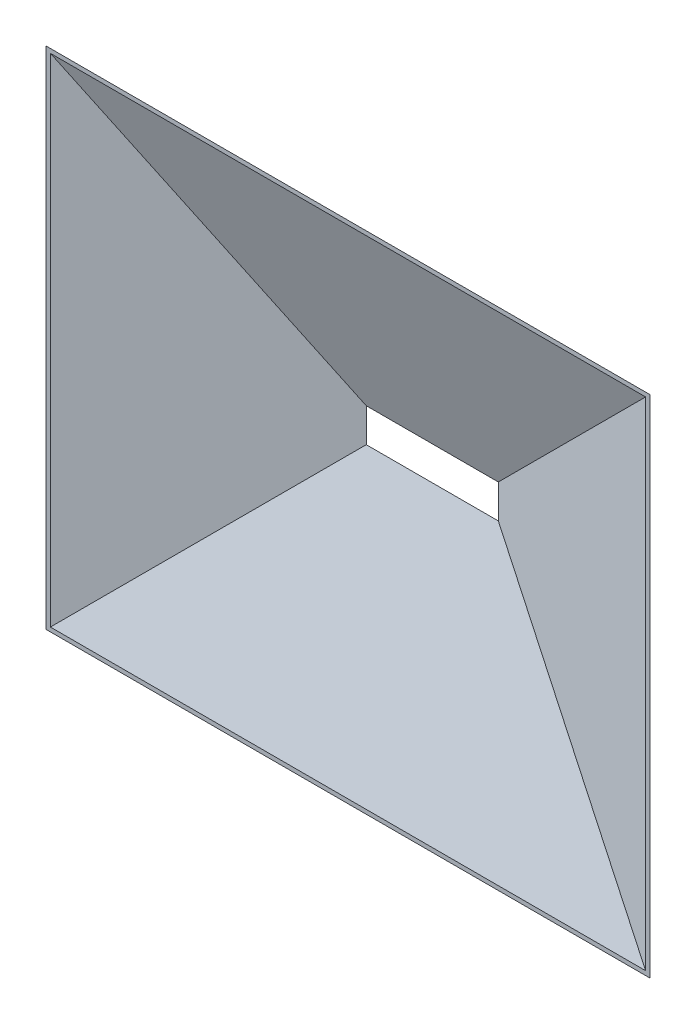
ISO-10303-21;
HEADER;
FILE_DESCRIPTION(('STEP AP214'),'2;1');
FILE_NAME('part.step','',(''),(''),'','','');
FILE_SCHEMA(('AUTOMOTIVE_DESIGN { 1 0 10303 214 1 1 1 1 }'));
ENDSEC;
DATA;
#1=APPLICATION_CONTEXT('core data for automotive mechanical design processes');
#2=APPLICATION_PROTOCOL_DEFINITION('international standard','automotive_design',2000,#1);
#3=PRODUCT_CONTEXT('',#1,'mechanical');
#4=PRODUCT('Part','Part','',(#3));
#5=PRODUCT_RELATED_PRODUCT_CATEGORY('part','',(#4));
#6=PRODUCT_DEFINITION_FORMATION('','',#4);
#7=PRODUCT_DEFINITION_CONTEXT('part definition',#1,'design');
#8=PRODUCT_DEFINITION('design','',#6,#7);
#9=PRODUCT_DEFINITION_SHAPE('','',#8);
#10=(LENGTH_UNIT() NAMED_UNIT(*) SI_UNIT(.MILLI.,.METRE.));
#11=(NAMED_UNIT(*) PLANE_ANGLE_UNIT() SI_UNIT($,.RADIAN.));
#12=(NAMED_UNIT(*) SI_UNIT($,.STERADIAN.) SOLID_ANGLE_UNIT());
#13=UNCERTAINTY_MEASURE_WITH_UNIT(LENGTH_MEASURE(1.E-05),#10,'distance_accuracy_value','');
#14=(GEOMETRIC_REPRESENTATION_CONTEXT(3) GLOBAL_UNCERTAINTY_ASSIGNED_CONTEXT((#13)) GLOBAL_UNIT_ASSIGNED_CONTEXT((#10,
#11,#12)) REPRESENTATION_CONTEXT('',''));
#15=CARTESIAN_POINT('',(0.,0.,0.));
#16=DIRECTION('',(0.,0.,1.));
#17=DIRECTION('',(1.,0.,0.));
#18=AXIS2_PLACEMENT_3D('',#15,#16,#17);
#19=CARTESIAN_POINT('',(50.,-15.,0.));
#20=DIRECTION('',(0.342020143325668,0.,-0.939692620785909));
#21=DIRECTION('',(-0.939692620785909,0.,-0.342020143325668));
#22=AXIS2_PLACEMENT_3D('',#19,#20,#21);
#23=PLANE('',#22);
#24=DIRECTION('',(0.,1.,0.));
#25=VECTOR('',#24,1.);
#26=CARTESIAN_POINT('',(50.,-15.,0.));
#27=LINE('',#26,#25);
#28=CARTESIAN_POINT('',(50.,-15.,0.));
#29=VERTEX_POINT('',#28);
#30=CARTESIAN_POINT('',(50.,15.,0.));
#31=VERTEX_POINT('',#30);
#32=EDGE_CURVE('E137',#29,#31,#27,.T.);
#33=ORIENTED_EDGE('',*,*,#32,.T.);
#34=DIRECTION('',(-0.684791078771736,-0.684791078771736,-0.249243569363953));
#35=VECTOR('',#34,1.);
#36=CARTESIAN_POINT('',(3.10611784346419,-31.8938821565358,-17.067977274166));
#37=LINE('',#36,#35);
#38=CARTESIAN_POINT('',(214.848645167278,179.848645167278,60.));
#39=VERTEX_POINT('',#38);
#40=EDGE_CURVE('E11',#39,#31,#37,.T.);
#41=ORIENTED_EDGE('',*,*,#40,.F.);
#42=DIRECTION('',(0.,-1.,0.));
#43=VECTOR('',#42,1.);
#44=CARTESIAN_POINT('',(214.848645167278,0.,60.));
#45=LINE('',#44,#43);
#46=CARTESIAN_POINT('',(214.848645167278,-179.848645167278,60.));
#47=VERTEX_POINT('',#46);
#48=EDGE_CURVE('E165',#47,#39,#45,.F.);
#49=ORIENTED_EDGE('',*,*,#48,.F.);
#50=DIRECTION('',(-0.684791078771736,0.684791078771736,-0.249243569363953));
#51=VECTOR('',#50,1.);
#52=CARTESIAN_POINT('',(50.,-15.,0.));
#53=LINE('',#52,#51);
#54=EDGE_CURVE('E167',#47,#29,#53,.T.);
#55=ORIENTED_EDGE('',*,*,#54,.T.);
#56=EDGE_LOOP('',(#33,#41,#49,#55));
#57=FACE_BOUND('',#56,.T.);
#58=ADVANCED_FACE('F38',(#57),#23,.T.);
#59=CARTESIAN_POINT('',(-50.,15.,0.));
#60=DIRECTION('',(0.,0.342020143325668,-0.939692620785909));
#61=DIRECTION('',(0.,0.939692620785909,0.342020143325668));
#62=AXIS2_PLACEMENT_3D('',#59,#60,#61);
#63=PLANE('',#62);
#64=DIRECTION('',(-1.,0.,0.));
#65=VECTOR('',#64,1.);
#66=CARTESIAN_POINT('',(-50.,15.,0.));
#67=LINE('',#66,#65);
#68=CARTESIAN_POINT('',(-50.,15.,0.));
#69=VERTEX_POINT('',#68);
#70=EDGE_CURVE('E157',#31,#69,#67,.T.);
#71=ORIENTED_EDGE('',*,*,#70,.T.);
#72=DIRECTION('',(0.684791078771736,-0.684791078771736,-0.249243569363953));
#73=VECTOR('',#72,1.);
#74=CARTESIAN_POINT('',(-35.9318353530393,0.931835353039258,-5.12039318224979));
#75=LINE('',#74,#73);
#76=CARTESIAN_POINT('',(-214.848645167278,179.848645167278,60.));
#77=VERTEX_POINT('',#76);
#78=EDGE_CURVE('E48',#77,#69,#75,.T.);
#79=ORIENTED_EDGE('',*,*,#78,.F.);
#80=DIRECTION('',(1.,0.,0.));
#81=VECTOR('',#80,1.);
#82=CARTESIAN_POINT('',(0.,179.848645167278,60.));
#83=LINE('',#82,#81);
#84=EDGE_CURVE('E181',#39,#77,#83,.F.);
#85=ORIENTED_EDGE('',*,*,#84,.F.);
#86=ORIENTED_EDGE('',*,*,#40,.T.);
#87=EDGE_LOOP('',(#71,#79,#85,#86));
#88=FACE_BOUND('',#87,.T.);
#89=ADVANCED_FACE('F40',(#88),#63,.T.);
#90=CARTESIAN_POINT('',(-50.,-15.,0.));
#91=DIRECTION('',(-0.342020143325668,0.,-0.939692620785909));
#92=DIRECTION('',(-0.939692620785909,0.,0.342020143325668));
#93=AXIS2_PLACEMENT_3D('',#90,#91,#92);
#94=PLANE('',#93);
#95=DIRECTION('',(0.,-1.,0.));
#96=VECTOR('',#95,1.);
#97=CARTESIAN_POINT('',(-50.,-15.,0.));
#98=LINE('',#97,#96);
#99=CARTESIAN_POINT('',(-50.,-15.,0.));
#100=VERTEX_POINT('',#99);
#101=EDGE_CURVE('E160',#69,#100,#98,.T.);
#102=ORIENTED_EDGE('',*,*,#101,.T.);
#103=DIRECTION('',(0.684791078771736,0.684791078771736,-0.249243569363953));
#104=VECTOR('',#103,1.);
#105=CARTESIAN_POINT('',(-50.,-15.,0.));
#106=LINE('',#105,#104);
#107=CARTESIAN_POINT('',(-214.848645167278,-179.848645167278,60.));
#108=VERTEX_POINT('',#107);
#109=EDGE_CURVE('E171',#108,#100,#106,.T.);
#110=ORIENTED_EDGE('',*,*,#109,.F.);
#111=DIRECTION('',(0.,1.,0.));
#112=VECTOR('',#111,1.);
#113=CARTESIAN_POINT('',(-214.848645167278,0.,60.));
#114=LINE('',#113,#112);
#115=EDGE_CURVE('E183',#77,#108,#114,.F.);
#116=ORIENTED_EDGE('',*,*,#115,.F.);
#117=ORIENTED_EDGE('',*,*,#78,.T.);
#118=EDGE_LOOP('',(#102,#110,#116,#117));
#119=FACE_BOUND('',#118,.T.);
#120=ADVANCED_FACE('F203',(#119),#94,.T.);
#121=CARTESIAN_POINT('',(-50.,-15.,0.));
#122=DIRECTION('',(0.,-0.342020143325668,-0.939692620785909));
#123=DIRECTION('',(0.,0.939692620785909,-0.342020143325668));
#124=AXIS2_PLACEMENT_3D('',#121,#122,#123);
#125=PLANE('',#124);
#126=DIRECTION('',(1.,0.,0.));
#127=VECTOR('',#126,1.);
#128=CARTESIAN_POINT('',(-50.,-15.,0.));
#129=LINE('',#128,#127);
#130=EDGE_CURVE('E163',#100,#29,#129,.T.);
#131=ORIENTED_EDGE('',*,*,#130,.T.);
#132=ORIENTED_EDGE('',*,*,#54,.F.);
#133=DIRECTION('',(-1.,0.,0.));
#134=VECTOR('',#133,1.);
#135=CARTESIAN_POINT('',(0.,-179.848645167278,60.));
#136=LINE('',#135,#134);
#137=EDGE_CURVE('E42',#108,#47,#136,.F.);
#138=ORIENTED_EDGE('',*,*,#137,.F.);
#139=ORIENTED_EDGE('',*,*,#109,.T.);
#140=EDGE_LOOP('',(#131,#132,#138,#139));
#141=FACE_BOUND('',#140,.T.);
#142=ADVANCED_FACE('F195',(#141),#125,.T.);
#143=CARTESIAN_POINT('',(0.,0.,60.));
#144=DIRECTION('',(0.,0.,-1.));
#145=DIRECTION('',(-1.,0.,0.));
#146=AXIS2_PLACEMENT_3D('',#143,#144,#145);
#147=PLANE('',#146);
#148=DIRECTION('',(-1.,0.,0.));
#149=VECTOR('',#148,1.);
#150=CARTESIAN_POINT('',(0.,-176.848645167279,60.));
#151=LINE('',#150,#149);
#152=CARTESIAN_POINT('',(211.848645167279,-176.848645167279,60.));
#153=VERTEX_POINT('',#152);
#154=CARTESIAN_POINT('',(-211.848645167279,-176.848645167279,60.));
#155=VERTEX_POINT('',#154);
#156=EDGE_CURVE('E139',#153,#155,#151,.T.);
#157=ORIENTED_EDGE('',*,*,#156,.T.);
#158=DIRECTION('',(0.,1.,0.));
#159=VECTOR('',#158,1.);
#160=CARTESIAN_POINT('',(-211.848645167279,0.,60.));
#161=LINE('',#160,#159);
#162=CARTESIAN_POINT('',(-211.848645167279,176.848645167279,60.));
#163=VERTEX_POINT('',#162);
#164=EDGE_CURVE('E130',#155,#163,#161,.T.);
#165=ORIENTED_EDGE('',*,*,#164,.T.);
#166=DIRECTION('',(1.,0.,0.));
#167=VECTOR('',#166,1.);
#168=CARTESIAN_POINT('',(0.,176.848645167279,60.));
#169=LINE('',#168,#167);
#170=CARTESIAN_POINT('',(211.848645167279,176.848645167279,60.));
#171=VERTEX_POINT('',#170);
#172=EDGE_CURVE('E146',#163,#171,#169,.T.);
#173=ORIENTED_EDGE('',*,*,#172,.T.);
#174=DIRECTION('',(0.,-1.,0.));
#175=VECTOR('',#174,1.);
#176=CARTESIAN_POINT('',(211.848645167279,0.,60.));
#177=LINE('',#176,#175);
#178=EDGE_CURVE('E56',#171,#153,#177,.T.);
#179=ORIENTED_EDGE('',*,*,#178,.T.);
#180=EDGE_LOOP('',(#157,#165,#173,#179));
#181=FACE_BOUND('',#180,.T.);
#182=ORIENTED_EDGE('',*,*,#48,.T.);
#183=ORIENTED_EDGE('',*,*,#84,.T.);
#184=ORIENTED_EDGE('',*,*,#115,.T.);
#185=ORIENTED_EDGE('',*,*,#137,.T.);
#186=EDGE_LOOP('',(#182,#183,#184,#185));
#187=FACE_BOUND('',#186,.T.);
#188=ADVANCED_FACE('F191',(#181,#187),#147,.F.);
#189=CARTESIAN_POINT('',(0.,0.,0.));
#190=DIRECTION('',(0.,0.,-1.));
#191=DIRECTION('',(-1.,0.,0.));
#192=AXIS2_PLACEMENT_3D('',#189,#190,#191);
#193=PLANE('',#192);
#194=DIRECTION('',(0.,1.,0.));
#195=VECTOR('',#194,1.);
#196=CARTESIAN_POINT('',(-47.,0.,0.));
#197=LINE('',#196,#195);
#198=CARTESIAN_POINT('',(-47.,-12.,0.));
#199=VERTEX_POINT('',#198);
#200=CARTESIAN_POINT('',(-47.,12.,0.));
#201=VERTEX_POINT('',#200);
#202=EDGE_CURVE('E64',#199,#201,#197,.T.);
#203=ORIENTED_EDGE('',*,*,#202,.F.);
#204=DIRECTION('',(-1.,0.,0.));
#205=VECTOR('',#204,1.);
#206=CARTESIAN_POINT('',(0.,-12.,0.));
#207=LINE('',#206,#205);
#208=CARTESIAN_POINT('',(47.,-12.,0.));
#209=VERTEX_POINT('',#208);
#210=EDGE_CURVE('E126',#209,#199,#207,.T.);
#211=ORIENTED_EDGE('',*,*,#210,.F.);
#212=DIRECTION('',(0.,-1.,0.));
#213=VECTOR('',#212,1.);
#214=CARTESIAN_POINT('',(47.,0.,0.));
#215=LINE('',#214,#213);
#216=CARTESIAN_POINT('',(47.,12.,0.));
#217=VERTEX_POINT('',#216);
#218=EDGE_CURVE('E108',#217,#209,#215,.T.);
#219=ORIENTED_EDGE('',*,*,#218,.F.);
#220=DIRECTION('',(1.,0.,0.));
#221=VECTOR('',#220,1.);
#222=CARTESIAN_POINT('',(0.,12.,0.));
#223=LINE('',#222,#221);
#224=EDGE_CURVE('E118',#201,#217,#223,.T.);
#225=ORIENTED_EDGE('',*,*,#224,.F.);
#226=EDGE_LOOP('',(#203,#211,#219,#225));
#227=FACE_BOUND('',#226,.T.);
#228=ORIENTED_EDGE('',*,*,#32,.F.);
#229=ORIENTED_EDGE('',*,*,#130,.F.);
#230=ORIENTED_EDGE('',*,*,#101,.F.);
#231=ORIENTED_EDGE('',*,*,#70,.F.);
#232=EDGE_LOOP('',(#228,#229,#230,#231));
#233=FACE_BOUND('',#232,.T.);
#234=ADVANCED_FACE('F123',(#227,#233),#193,.T.);
#235=CARTESIAN_POINT('',(-47.,0.,0.));
#236=DIRECTION('',(-0.342020143325666,0.,-0.939692620785909));
#237=DIRECTION('',(-0.939692620785909,0.,0.342020143325666));
#238=AXIS2_PLACEMENT_3D('',#235,#236,#237);
#239=PLANE('',#238);
#240=ORIENTED_EDGE('',*,*,#202,.T.);
#241=DIRECTION('',(0.684791078771736,-0.684791078771736,-0.249243569363952));
#242=VECTOR('',#241,1.);
#243=CARTESIAN_POINT('',(-41.3727341412157,6.3727341412157,-2.04815727289991));
#244=LINE('',#243,#242);
#245=EDGE_CURVE('E115',#163,#201,#244,.T.);
#246=ORIENTED_EDGE('',*,*,#245,.F.);
#247=ORIENTED_EDGE('',*,*,#164,.F.);
#248=DIRECTION('',(0.684791078771736,0.684791078771736,-0.249243569363952));
#249=VECTOR('',#248,1.);
#250=CARTESIAN_POINT('',(-24.9598753864282,10.0401246135718,-8.02194931885797));
#251=LINE('',#250,#249);
#252=EDGE_CURVE('E134',#155,#199,#251,.T.);
#253=ORIENTED_EDGE('',*,*,#252,.T.);
#254=EDGE_LOOP('',(#240,#246,#247,#253));
#255=FACE_BOUND('',#254,.T.);
#256=ADVANCED_FACE('F205',(#255),#239,.F.);
#257=CARTESIAN_POINT('',(0.,-12.,0.));
#258=DIRECTION('',(0.,-0.342020143325666,-0.939692620785909));
#259=DIRECTION('',(0.,0.939692620785909,-0.342020143325666));
#260=AXIS2_PLACEMENT_3D('',#257,#258,#259);
#261=PLANE('',#260);
#262=ORIENTED_EDGE('',*,*,#210,.T.);
#263=ORIENTED_EDGE('',*,*,#252,.F.);
#264=ORIENTED_EDGE('',*,*,#156,.F.);
#265=DIRECTION('',(-0.684791078771736,0.684791078771736,-0.249243569363952));
#266=VECTOR('',#265,1.);
#267=CARTESIAN_POINT('',(41.3727341412157,-6.3727341412157,-2.04815727289991));
#268=LINE('',#267,#266);
#269=EDGE_CURVE('E114',#153,#209,#268,.T.);
#270=ORIENTED_EDGE('',*,*,#269,.T.);
#271=EDGE_LOOP('',(#262,#263,#264,#270));
#272=FACE_BOUND('',#271,.T.);
#273=ADVANCED_FACE('F212',(#272),#261,.F.);
#274=CARTESIAN_POINT('',(47.,0.,0.));
#275=DIRECTION('',(0.342020143325666,0.,-0.939692620785909));
#276=DIRECTION('',(-0.939692620785909,0.,-0.342020143325666));
#277=AXIS2_PLACEMENT_3D('',#274,#275,#276);
#278=PLANE('',#277);
#279=ORIENTED_EDGE('',*,*,#218,.T.);
#280=ORIENTED_EDGE('',*,*,#269,.F.);
#281=ORIENTED_EDGE('',*,*,#178,.F.);
#282=DIRECTION('',(-0.684791078771736,-0.684791078771736,-0.249243569363952));
#283=VECTOR('',#282,1.);
#284=CARTESIAN_POINT('',(24.9598753864282,-10.0401246135718,-8.02194931885797));
#285=LINE('',#284,#283);
#286=EDGE_CURVE('E104',#171,#217,#285,.T.);
#287=ORIENTED_EDGE('',*,*,#286,.T.);
#288=EDGE_LOOP('',(#279,#280,#281,#287));
#289=FACE_BOUND('',#288,.T.);
#290=ADVANCED_FACE('F106',(#289),#278,.F.);
#291=CARTESIAN_POINT('',(0.,12.,0.));
#292=DIRECTION('',(0.,0.342020143325666,-0.939692620785909));
#293=DIRECTION('',(0.,0.939692620785909,0.342020143325666));
#294=AXIS2_PLACEMENT_3D('',#291,#292,#293);
#295=PLANE('',#294);
#296=ORIENTED_EDGE('',*,*,#224,.T.);
#297=ORIENTED_EDGE('',*,*,#286,.F.);
#298=ORIENTED_EDGE('',*,*,#172,.F.);
#299=ORIENTED_EDGE('',*,*,#245,.T.);
#300=EDGE_LOOP('',(#296,#297,#298,#299));
#301=FACE_BOUND('',#300,.T.);
#302=ADVANCED_FACE('F119',(#301),#295,.F.);
#303=CLOSED_SHELL('',(#58,#89,#120,#142,#188,#234,#256,#273,#290,#302));
#304=MANIFOLD_SOLID_BREP('B2',#303);
#305=ADVANCED_BREP_SHAPE_REPRESENTATION('',(#18,#304),#14);
#306=SHAPE_DEFINITION_REPRESENTATION(#9,#305);
ENDSEC;
END-ISO-10303-21;
